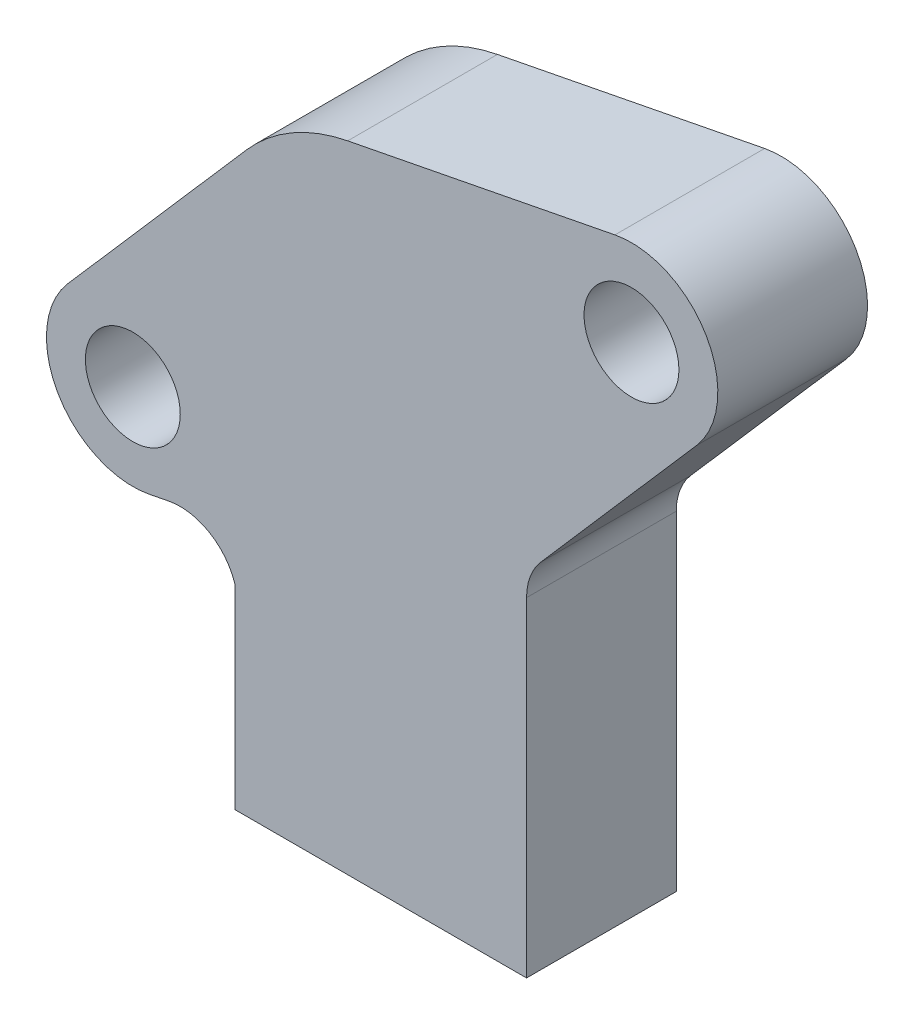
ISO-10303-21;
HEADER;
FILE_DESCRIPTION(('STEP AP214'),'2;1');
FILE_NAME('part.step','',(''),(''),'','','');
FILE_SCHEMA(('AUTOMOTIVE_DESIGN { 1 0 10303 214 1 1 1 1 }'));
ENDSEC;
DATA;
#1=APPLICATION_CONTEXT('core data for automotive mechanical design processes');
#2=APPLICATION_PROTOCOL_DEFINITION('international standard','automotive_design',2000,#1);
#3=PRODUCT_CONTEXT('',#1,'mechanical');
#4=PRODUCT('Part','Part','',(#3));
#5=PRODUCT_RELATED_PRODUCT_CATEGORY('part','',(#4));
#6=PRODUCT_DEFINITION_FORMATION('','',#4);
#7=PRODUCT_DEFINITION_CONTEXT('part definition',#1,'design');
#8=PRODUCT_DEFINITION('design','',#6,#7);
#9=PRODUCT_DEFINITION_SHAPE('','',#8);
#10=(LENGTH_UNIT() NAMED_UNIT(*) SI_UNIT(.MILLI.,.METRE.));
#11=(NAMED_UNIT(*) PLANE_ANGLE_UNIT() SI_UNIT($,.RADIAN.));
#12=(NAMED_UNIT(*) SI_UNIT($,.STERADIAN.) SOLID_ANGLE_UNIT());
#13=UNCERTAINTY_MEASURE_WITH_UNIT(LENGTH_MEASURE(1.E-05),#10,'distance_accuracy_value','');
#14=(GEOMETRIC_REPRESENTATION_CONTEXT(3) GLOBAL_UNCERTAINTY_ASSIGNED_CONTEXT((#13)) GLOBAL_UNIT_ASSIGNED_CONTEXT((#10,
#11,#12)) REPRESENTATION_CONTEXT('',''));
#15=CARTESIAN_POINT('',(0.,0.,0.));
#16=DIRECTION('',(0.,0.,1.));
#17=DIRECTION('',(1.,0.,0.));
#18=AXIS2_PLACEMENT_3D('',#15,#16,#17);
#19=CARTESIAN_POINT('',(8.9745656774153E-07,-3.76355821948626,-50.9532185088814));
#20=DIRECTION('',(-2.384595947247E-07,0.999999999999972,0.));
#21=DIRECTION('',(-0.999999999999972,-2.384595947247E-07,0.));
#22=AXIS2_PLACEMENT_3D('',#19,#20,#21);
#23=PLANE('',#22);
#24=DIRECTION('',(0.999999999999972,2.384595947247E-07,0.));
#25=VECTOR('',#24,1.);
#26=CARTESIAN_POINT('',(0.293919494826474,-3.76355814939855,9.09232219310188));
#27=LINE('',#26,#25);
#28=CARTESIAN_POINT('',(11.194976877036,-3.76355554993682,9.09232219310188));
#29=VERTEX_POINT('',#28);
#30=CARTESIAN_POINT('',(13.8410319973325,-3.76355491895921,9.09232219310188));
#31=VERTEX_POINT('',#30);
#32=EDGE_CURVE('E464',#29,#31,#27,.T.);
#33=ORIENTED_EDGE('',*,*,#32,.T.);
#34=DIRECTION('',(0.,0.,1.));
#35=VECTOR('',#34,1.);
#36=CARTESIAN_POINT('',(13.8410335872619,-3.76355491895921,-50.9532185088814));
#37=LINE('',#36,#35);
#38=CARTESIAN_POINT('',(13.8410335872619,-3.76355491895921,2.10732219310188));
#39=VERTEX_POINT('',#38);
#40=EDGE_CURVE('E355',#39,#31,#37,.T.);
#41=ORIENTED_EDGE('',*,*,#40,.F.);
#42=DIRECTION('',(0.999999999999972,2.384595947247E-07,0.));
#43=VECTOR('',#42,1.);
#44=CARTESIAN_POINT('',(8.9745656774153E-07,-3.76355821948626,2.10732219310188));
#45=LINE('',#44,#43);
#46=CARTESIAN_POINT('',(11.1949765410443,-3.76355653417888,2.10732219310188));
#47=VERTEX_POINT('',#46);
#48=EDGE_CURVE('E372',#47,#39,#45,.T.);
#49=ORIENTED_EDGE('',*,*,#48,.F.);
#50=DIRECTION('',(0.,0.,-1.));
#51=VECTOR('',#50,1.);
#52=CARTESIAN_POINT('',(11.1949765410441,-3.7635555499369,0.));
#53=LINE('',#52,#51);
#54=EDGE_CURVE('E363',#29,#47,#53,.T.);
#55=ORIENTED_EDGE('',*,*,#54,.F.);
#56=EDGE_LOOP('',(#33,#41,#49,#55));
#57=FACE_BOUND('',#56,.T.);
#58=ADVANCED_FACE('F41',(#57),#23,.T.);
#59=CARTESIAN_POINT('',(0.,0.,2.10732219310188));
#60=DIRECTION('',(0.,0.,1.));
#61=DIRECTION('',(1.,0.,0.));
#62=AXIS2_PLACEMENT_3D('',#59,#60,#61);
#63=PLANE('',#62);
#64=CARTESIAN_POINT('',(-6.60002350758909,12.2130402066751,2.10732219310188));
#65=DIRECTION('',(0.,0.,1.));
#66=DIRECTION('',(1.,0.,0.));
#67=AXIS2_PLACEMENT_3D('',#64,#65,#66);
#68=CIRCLE('',#67,2.6162);
#69=CARTESIAN_POINT('',(-3.98382350758909,12.2130402066751,2.10732219310188));
#70=VERTEX_POINT('',#69);
#71=EDGE_CURVE('E167',#70,#70,#68,.F.);
#72=ORIENTED_EDGE('',*,*,#71,.F.);
#73=EDGE_LOOP('',(#72));
#74=FACE_BOUND('',#73,.T.);
#75=CARTESIAN_POINT('',(20.8962792770201,28.0880467634327,2.10732219310188));
#76=DIRECTION('',(0.,0.,1.));
#77=DIRECTION('',(1.,0.,0.));
#78=AXIS2_PLACEMENT_3D('',#75,#76,#77);
#79=CIRCLE('',#78,2.6162);
#80=CARTESIAN_POINT('',(23.5124792770201,28.0880467634327,2.10732219310188));
#81=VERTEX_POINT('',#80);
#82=EDGE_CURVE('E163',#81,#81,#79,.F.);
#83=ORIENTED_EDGE('',*,*,#82,.F.);
#84=EDGE_LOOP('',(#83));
#85=FACE_BOUND('',#84,.T.);
#86=DIRECTION('',(2.38459594582664E-07,-0.999999999999971,0.));
#87=VECTOR('',#86,1.);
#88=CARTESIAN_POINT('',(11.194973962423,7.05010479643418,2.10732219310188));
#89=LINE('',#88,#87);
#90=CARTESIAN_POINT('',(11.1949768741737,-5.16056204205785,2.10732219310188));
#91=VERTEX_POINT('',#90);
#92=EDGE_CURVE('E340',#47,#91,#89,.T.);
#93=ORIENTED_EDGE('',*,*,#92,.F.);
#94=ORIENTED_EDGE('',*,*,#48,.T.);
#95=DIRECTION('',(-2.38459594475553E-07,0.999999999999972,0.));
#96=VECTOR('',#95,1.);
#97=CARTESIAN_POINT('',(13.8410326898053,3.30052704233395E-06,2.10732219310188));
#98=LINE('',#97,#96);
#99=CARTESIAN_POINT('',(13.8410319973325,2.97940231943418,2.10732219310188));
#100=VERTEX_POINT('',#99);
#101=EDGE_CURVE('E275',#39,#100,#98,.T.);
#102=ORIENTED_EDGE('',*,*,#101,.T.);
#103=DIRECTION('',(-1.,0.,0.));
#104=VECTOR('',#103,1.);
#105=CARTESIAN_POINT('',(0.,2.97940231943418,2.10732219310188));
#106=LINE('',#105,#104);
#107=CARTESIAN_POINT('',(0.293916587527097,2.97940231943418,2.10732219310188));
#108=VERTEX_POINT('',#107);
#109=EDGE_CURVE('E270',#100,#108,#106,.T.);
#110=ORIENTED_EDGE('',*,*,#109,.T.);
#111=DIRECTION('',(2.38459594605641E-07,-0.999999999999972,0.));
#112=VECTOR('',#111,1.);
#113=CARTESIAN_POINT('',(0.293918597369907,7.00877095758887E-08,2.10732219310188));
#114=LINE('',#113,#112);
#115=CARTESIAN_POINT('',(0.293919494826474,-3.76355814939855,2.10732219310188));
#116=VERTEX_POINT('',#115);
#117=EDGE_CURVE('E347',#108,#116,#114,.T.);
#118=ORIENTED_EDGE('',*,*,#117,.T.);
#119=CARTESIAN_POINT('',(2.9399765410443,-3.76355751842085,2.10732219310188));
#120=VERTEX_POINT('',#119);
#121=EDGE_CURVE('E260',#116,#120,#45,.T.);
#122=ORIENTED_EDGE('',*,*,#121,.T.);
#123=DIRECTION('',(2.38459594582664E-07,-0.999999999999971,0.));
#124=VECTOR('',#123,1.);
#125=CARTESIAN_POINT('',(2.93997396242324,7.05010282795023,2.10732219310188));
#126=LINE('',#125,#124);
#127=CARTESIAN_POINT('',(2.93997687417236,-5.16055751842081,2.10732219310188));
#128=VERTEX_POINT('',#127);
#129=EDGE_CURVE('E240',#120,#128,#126,.T.);
#130=ORIENTED_EDGE('',*,*,#129,.T.);
#131=DIRECTION('',(-0.999999999999972,-2.38459594582664E-07,0.));
#132=VECTOR('',#131,1.);
#133=CARTESIAN_POINT('',(1.23058462083895E-06,-5.16055821948621,2.10732219310188));
#134=LINE('',#133,#132);
#135=CARTESIAN_POINT('',(-0.976080172045436,-5.16055845224219,2.10732219310188));
#136=VERTEX_POINT('',#135);
#137=EDGE_CURVE('E256',#128,#136,#134,.T.);
#138=ORIENTED_EDGE('',*,*,#137,.T.);
#139=DIRECTION('',(2.38459593380394E-07,-0.999999999999972,0.));
#140=VECTOR('',#139,1.);
#141=CARTESIAN_POINT('',(-0.976081402630059,-2.32755974377335E-07,2.10732219310188));
#142=LINE('',#141,#140);
#143=CARTESIAN_POINT('',(-0.976082746216754,5.63444154775751,2.10732219310188));
#144=VERTEX_POINT('',#143);
#145=EDGE_CURVE('E359',#144,#136,#142,.T.);
#146=ORIENTED_EDGE('',*,*,#145,.F.);
#147=CARTESIAN_POINT('',(-3.9897684155214,4.63528005599162,2.10732219310188));
#148=DIRECTION('',(0.,0.,1.));
#149=DIRECTION('',(1.,0.,0.));
#150=AXIS2_PLACEMENT_3D('',#147,#148,#149);
#151=CIRCLE('',#150,3.175);
#152=CARTESIAN_POINT('',(-4.5981191947007,7.7514530822326,2.10732219310188));
#153=VERTEX_POINT('',#152);
#154=EDGE_CURVE('E280',#153,#144,#151,.F.);
#155=ORIENTED_EDGE('',*,*,#154,.F.);
#156=DIRECTION('',(0.981471819288502,0.191606544623399,0.));
#157=VECTOR('',#156,1.);
#158=CARTESIAN_POINT('',(-1.62652160937931,8.33157931117255,2.10732219310188));
#159=LINE('',#158,#157);
#160=CARTESIAN_POINT('',(-5.68749733882018,7.53878066731364,2.10732219310188));
#161=VERTEX_POINT('',#160);
#162=EDGE_CURVE('E171',#161,#153,#159,.T.);
#163=ORIENTED_EDGE('',*,*,#162,.F.);
#164=CARTESIAN_POINT('',(-6.60002350758909,12.2130402066751,2.10732219310188));
#165=DIRECTION('',(0.,0.,1.));
#166=DIRECTION('',(1.,0.,0.));
#167=AXIS2_PLACEMENT_3D('',#164,#165,#166);
#168=CIRCLE('',#167,4.7625);
#169=CARTESIAN_POINT('',(-10.1917894196903,15.3404391071461,2.10732219310188));
#170=VERTEX_POINT('',#169);
#171=EDGE_CURVE('E104',#170,#161,#168,.T.);
#172=ORIENTED_EDGE('',*,*,#171,.F.);
#173=DIRECTION('',(-0.656671685138276,-0.754176569470079,0.));
#174=VECTOR('',#173,1.);
#175=CARTESIAN_POINT('',(-13.3942066295272,11.6625159074911,2.10732219310188));
#176=LINE('',#175,#174);
#177=CARTESIAN_POINT('',(-0.332323254887378,26.6638729284349,2.10732219310188));
#178=VERTEX_POINT('',#177);
#179=EDGE_CURVE('E191',#178,#170,#176,.T.);
#180=ORIENTED_EDGE('',*,*,#179,.F.);
#181=CARTESIAN_POINT('',(7.1481278847155,20.1505434850539,2.10732219310188));
#182=DIRECTION('',(0.,0.,1.));
#183=DIRECTION('',(1.,0.,0.));
#184=AXIS2_PLACEMENT_3D('',#181,#182,#183);
#185=CIRCLE('',#184,9.9187);
#186=CARTESIAN_POINT('',(5.2476400505594,29.8854680190308,2.10732219310188));
#187=VERTEX_POINT('',#186);
#188=EDGE_CURVE('E148',#187,#178,#185,.T.);
#189=ORIENTED_EDGE('',*,*,#188,.F.);
#190=DIRECTION('',(-0.981471819288502,-0.191606544623398,0.));
#191=VECTOR('',#190,1.);
#192=CARTESIAN_POINT('',(-5.4274972776915,27.8014283791263,2.10732219310188));
#193=LINE('',#192,#191);
#194=CARTESIAN_POINT('',(19.9837531082512,32.7623063027941,2.10732219310188));
#195=VERTEX_POINT('',#194);
#196=EDGE_CURVE('E186',#195,#187,#193,.T.);
#197=ORIENTED_EDGE('',*,*,#196,.F.);
#198=CARTESIAN_POINT('',(20.8962792770201,28.0880467634327,2.10732219310188));
#199=DIRECTION('',(0.,0.,1.));
#200=DIRECTION('',(1.,0.,0.));
#201=AXIS2_PLACEMENT_3D('',#198,#199,#200);
#202=CIRCLE('',#201,4.7625);
#203=CARTESIAN_POINT('',(24.4880451891213,24.9606478629617,2.10732219310188));
#204=VERTEX_POINT('',#203);
#205=EDGE_CURVE('E183',#204,#195,#202,.T.);
#206=ORIENTED_EDGE('',*,*,#205,.F.);
#207=DIRECTION('',(0.656671685138276,0.754176569470079,0.));
#208=VECTOR('',#207,1.);
#209=CARTESIAN_POINT('',(1.56669564967859,-1.36414297927093,2.10732219310188));
#210=LINE('',#209,#208);
#211=CARTESIAN_POINT('',(15.8915189811089,15.0876796938632,2.10732219310188));
#212=VERTEX_POINT('',#211);
#213=EDGE_CURVE('E180',#212,#204,#210,.T.);
#214=ORIENTED_EDGE('',*,*,#213,.F.);
#215=CARTESIAN_POINT('',(18.2860295891764,13.0027470935492,2.10732219310188));
#216=DIRECTION('',(0.,0.,1.));
#217=DIRECTION('',(1.,0.,0.));
#218=AXIS2_PLACEMENT_3D('',#215,#216,#217);
#219=CIRCLE('',#218,3.175);
#220=CARTESIAN_POINT('',(15.1110295891765,13.00274633644,2.10732219310188));
#221=VERTEX_POINT('',#220);
#222=EDGE_CURVE('E177',#221,#212,#219,.F.);
#223=ORIENTED_EDGE('',*,*,#222,.F.);
#224=DIRECTION('',(-2.3845959454018E-07,0.999999999999972,0.));
#225=VECTOR('',#224,1.);
#226=CARTESIAN_POINT('',(15.1110326898053,3.60337072829448E-06,2.10732219310188));
#227=LINE('',#226,#225);
#228=CARTESIAN_POINT('',(15.1110339203899,-5.16055461611548,2.10732219310188));
#229=VERTEX_POINT('',#228);
#230=EDGE_CURVE('E174',#229,#221,#227,.T.);
#231=ORIENTED_EDGE('',*,*,#230,.F.);
#232=EDGE_CURVE('E45',#229,#91,#134,.T.);
#233=ORIENTED_EDGE('',*,*,#232,.T.);
#234=EDGE_LOOP('',(#93,#94,#102,#110,#118,#122,#130,#138,#146,#155,#163,#172,#180,#189,#197,
#206,#214,#223,#231,#233));
#235=FACE_BOUND('',#234,.T.);
#236=ADVANCED_FACE('F253',(#74,#85,#235),#63,.F.);
#237=CARTESIAN_POINT('',(0.293919494826474,-3.76355814939855,9.09232219310188));
#238=VERTEX_POINT('',#237);
#239=CARTESIAN_POINT('',(2.93997396003667,-3.76355751842147,9.09232219310188));
#240=VERTEX_POINT('',#239);
#241=EDGE_CURVE('E452',#238,#240,#27,.T.);
#242=ORIENTED_EDGE('',*,*,#241,.T.);
#243=DIRECTION('',(0.,0.,-1.));
#244=VECTOR('',#243,1.);
#245=CARTESIAN_POINT('',(2.9399765410443,-3.76355751842086,0.));
#246=LINE('',#245,#244);
#247=EDGE_CURVE('E262',#240,#120,#246,.T.);
#248=ORIENTED_EDGE('',*,*,#247,.T.);
#249=ORIENTED_EDGE('',*,*,#121,.F.);
#250=DIRECTION('',(0.,0.,1.));
#251=VECTOR('',#250,1.);
#252=CARTESIAN_POINT('',(0.293919494826474,-3.76355814939855,-50.9532185088814));
#253=LINE('',#252,#251);
#254=EDGE_CURVE('E351',#116,#238,#253,.T.);
#255=ORIENTED_EDGE('',*,*,#254,.T.);
#256=EDGE_LOOP('',(#242,#248,#249,#255));
#257=FACE_BOUND('',#256,.T.);
#258=ADVANCED_FACE('F451',(#257),#23,.T.);
#259=CARTESIAN_POINT('',(1.23058462083895E-06,-5.16055821948621,-50.9532185088814));
#260=DIRECTION('',(2.38459594582664E-07,-0.999999999999972,0.));
#261=DIRECTION('',(0.999999999999972,2.38459594582664E-07,0.));
#262=AXIS2_PLACEMENT_3D('',#259,#260,#261);
#263=PLANE('',#262);
#264=DIRECTION('',(0.999999999999972,2.38459594582664E-07,0.));
#265=VECTOR('',#264,1.);
#266=CARTESIAN_POINT('',(1.23058462083895E-06,-5.16055821948621,9.09232219310189));
#267=LINE('',#266,#265);
#268=CARTESIAN_POINT('',(2.93997687178555,-5.16055653417914,9.09232219310188));
#269=VERTEX_POINT('',#268);
#270=CARTESIAN_POINT('',(11.1949768770389,-5.16055554993686,9.09232219310189));
#271=VERTEX_POINT('',#270);
#272=EDGE_CURVE('E223',#269,#271,#267,.T.);
#273=ORIENTED_EDGE('',*,*,#272,.T.);
#274=DIRECTION('',(0.,0.,-1.));
#275=VECTOR('',#274,1.);
#276=CARTESIAN_POINT('',(11.1949768741721,-5.16055554993686,-50.9532185088814));
#277=LINE('',#276,#275);
#278=EDGE_CURVE('E11',#271,#91,#277,.T.);
#279=ORIENTED_EDGE('',*,*,#278,.T.);
#280=ORIENTED_EDGE('',*,*,#232,.F.);
#281=DIRECTION('',(0.,0.,1.));
#282=VECTOR('',#281,1.);
#283=CARTESIAN_POINT('',(15.1110339203899,-5.16055461611548,-50.9532185088814));
#284=LINE('',#283,#282);
#285=CARTESIAN_POINT('',(15.1110339203899,-5.16055461611548,10.3623221931019));
#286=VERTEX_POINT('',#285);
#287=EDGE_CURVE('E335',#229,#286,#284,.T.);
#288=ORIENTED_EDGE('',*,*,#287,.T.);
#289=DIRECTION('',(0.999999999999972,2.38459594582664E-07,0.));
#290=VECTOR('',#289,1.);
#291=CARTESIAN_POINT('',(1.23058462083895E-06,-5.16055821948621,10.3623221931019));
#292=LINE('',#291,#290);
#293=CARTESIAN_POINT('',(-0.976080172045436,-5.16055845224219,10.3623221931019));
#294=VERTEX_POINT('',#293);
#295=EDGE_CURVE('E343',#294,#286,#292,.T.);
#296=ORIENTED_EDGE('',*,*,#295,.F.);
#297=DIRECTION('',(0.,0.,1.));
#298=VECTOR('',#297,1.);
#299=CARTESIAN_POINT('',(-0.976080172045436,-5.16055845224219,-50.9532185088814));
#300=LINE('',#299,#298);
#301=EDGE_CURVE('E268',#136,#294,#300,.T.);
#302=ORIENTED_EDGE('',*,*,#301,.F.);
#303=ORIENTED_EDGE('',*,*,#137,.F.);
#304=DIRECTION('',(0.,0.,-1.));
#305=VECTOR('',#304,1.);
#306=CARTESIAN_POINT('',(2.93997687417236,-5.16055751842081,-50.9532185088814));
#307=LINE('',#306,#305);
#308=EDGE_CURVE('E52',#269,#128,#307,.T.);
#309=ORIENTED_EDGE('',*,*,#308,.F.);
#310=EDGE_LOOP('',(#273,#279,#280,#288,#296,#302,#303,#309));
#311=FACE_BOUND('',#310,.T.);
#312=ADVANCED_FACE('F265',(#311),#263,.T.);
#313=CARTESIAN_POINT('',(-1.62652160937931,8.33157931117255,10.3623221931019));
#314=DIRECTION('',(-0.191606544623399,0.981471819288502,0.));
#315=DIRECTION('',(-0.981471819288502,-0.191606544623399,0.));
#316=AXIS2_PLACEMENT_3D('',#313,#314,#315);
#317=PLANE('',#316);
#318=ORIENTED_EDGE('',*,*,#162,.T.);
#319=DIRECTION('',(0.,0.,-1.));
#320=VECTOR('',#319,1.);
#321=CARTESIAN_POINT('',(-4.5981191947007,7.7514530822326,10.3623221931019));
#322=LINE('',#321,#320);
#323=CARTESIAN_POINT('',(-4.5981191947007,7.7514530822326,10.3623221931019));
#324=VERTEX_POINT('',#323);
#325=EDGE_CURVE('E219',#324,#153,#322,.T.);
#326=ORIENTED_EDGE('',*,*,#325,.F.);
#327=DIRECTION('',(0.981471819288502,0.191606544623399,0.));
#328=VECTOR('',#327,1.);
#329=CARTESIAN_POINT('',(-1.62652160937931,8.33157931117255,10.3623221931019));
#330=LINE('',#329,#328);
#331=CARTESIAN_POINT('',(-5.68749733882018,7.53878066731364,10.3623221931019));
#332=VERTEX_POINT('',#331);
#333=EDGE_CURVE('E110',#332,#324,#330,.T.);
#334=ORIENTED_EDGE('',*,*,#333,.F.);
#335=DIRECTION('',(0.,0.,-1.));
#336=VECTOR('',#335,1.);
#337=CARTESIAN_POINT('',(-5.68749733882018,7.53878066731364,10.3623221931019));
#338=LINE('',#337,#336);
#339=EDGE_CURVE('E159',#332,#161,#338,.T.);
#340=ORIENTED_EDGE('',*,*,#339,.T.);
#341=EDGE_LOOP('',(#318,#326,#334,#340));
#342=FACE_BOUND('',#341,.T.);
#343=ADVANCED_FACE('F316',(#342),#317,.F.);
#344=CARTESIAN_POINT('',(15.1110326898053,3.60337072829448E-06,10.3623221931019));
#345=DIRECTION('',(-0.999999999999972,-2.3845959454018E-07,0.));
#346=DIRECTION('',(2.3845959454018E-07,-0.999999999999972,0.));
#347=AXIS2_PLACEMENT_3D('',#344,#345,#346);
#348=PLANE('',#347);
#349=ORIENTED_EDGE('',*,*,#230,.T.);
#350=DIRECTION('',(0.,0.,-1.));
#351=VECTOR('',#350,1.);
#352=CARTESIAN_POINT('',(15.1110295891765,13.00274633644,10.3623221931019));
#353=LINE('',#352,#351);
#354=CARTESIAN_POINT('',(15.1110295891765,13.00274633644,10.3623221931019));
#355=VERTEX_POINT('',#354);
#356=EDGE_CURVE('E215',#355,#221,#353,.T.);
#357=ORIENTED_EDGE('',*,*,#356,.F.);
#358=DIRECTION('',(-2.3845959454018E-07,0.999999999999972,0.));
#359=VECTOR('',#358,1.);
#360=CARTESIAN_POINT('',(15.1110326898053,3.60337072829448E-06,10.3623221931019));
#361=LINE('',#360,#359);
#362=EDGE_CURVE('E291',#286,#355,#361,.T.);
#363=ORIENTED_EDGE('',*,*,#362,.F.);
#364=ORIENTED_EDGE('',*,*,#287,.F.);
#365=EDGE_LOOP('',(#349,#357,#363,#364));
#366=FACE_BOUND('',#365,.T.);
#367=ADVANCED_FACE('F476',(#366),#348,.F.);
#368=CARTESIAN_POINT('',(18.2860295891764,13.0027470935492,10.3623221931019));
#369=DIRECTION('',(0.,0.,-1.));
#370=DIRECTION('',(-1.,0.,0.));
#371=AXIS2_PLACEMENT_3D('',#368,#369,#370);
#372=CYLINDRICAL_SURFACE('',#371,3.175);
#373=ORIENTED_EDGE('',*,*,#222,.T.);
#374=DIRECTION('',(0.,0.,-1.));
#375=VECTOR('',#374,1.);
#376=CARTESIAN_POINT('',(15.8915189811089,15.0876796938632,10.3623221931019));
#377=LINE('',#376,#375);
#378=CARTESIAN_POINT('',(15.8915189811089,15.0876796938632,10.3623221931019));
#379=VERTEX_POINT('',#378);
#380=EDGE_CURVE('E211',#379,#212,#377,.T.);
#381=ORIENTED_EDGE('',*,*,#380,.F.);
#382=CARTESIAN_POINT('',(18.2860295891764,13.0027470935492,10.3623221931019));
#383=DIRECTION('',(0.,0.,1.));
#384=DIRECTION('',(1.,0.,0.));
#385=AXIS2_PLACEMENT_3D('',#382,#383,#384);
#386=CIRCLE('',#385,3.175);
#387=EDGE_CURVE('E294',#355,#379,#386,.F.);
#388=ORIENTED_EDGE('',*,*,#387,.F.);
#389=ORIENTED_EDGE('',*,*,#356,.T.);
#390=EDGE_LOOP('',(#373,#381,#388,#389));
#391=FACE_BOUND('',#390,.T.);
#392=ADVANCED_FACE('F480',(#391),#372,.F.);
#393=CARTESIAN_POINT('',(1.56669564967859,-1.36414297927093,10.3623221931019));
#394=DIRECTION('',(-0.754176569470079,0.656671685138276,0.));
#395=DIRECTION('',(-0.656671685138276,-0.754176569470079,0.));
#396=AXIS2_PLACEMENT_3D('',#393,#394,#395);
#397=PLANE('',#396);
#398=ORIENTED_EDGE('',*,*,#213,.T.);
#399=DIRECTION('',(0.,0.,-1.));
#400=VECTOR('',#399,1.);
#401=CARTESIAN_POINT('',(24.4880451891213,24.9606478629617,10.3623221931019));
#402=LINE('',#401,#400);
#403=CARTESIAN_POINT('',(24.4880451891213,24.9606478629617,10.3623221931019));
#404=VERTEX_POINT('',#403);
#405=EDGE_CURVE('E207',#404,#204,#402,.T.);
#406=ORIENTED_EDGE('',*,*,#405,.F.);
#407=DIRECTION('',(0.656671685138276,0.754176569470079,0.));
#408=VECTOR('',#407,1.);
#409=CARTESIAN_POINT('',(1.56669564967859,-1.36414297927093,10.3623221931019));
#410=LINE('',#409,#408);
#411=EDGE_CURVE('E297',#379,#404,#410,.T.);
#412=ORIENTED_EDGE('',*,*,#411,.F.);
#413=ORIENTED_EDGE('',*,*,#380,.T.);
#414=EDGE_LOOP('',(#398,#406,#412,#413));
#415=FACE_BOUND('',#414,.T.);
#416=ADVANCED_FACE('F482',(#415),#397,.F.);
#417=CARTESIAN_POINT('',(20.8962792770201,28.0880467634327,10.3623221931019));
#418=DIRECTION('',(0.,0.,-1.));
#419=DIRECTION('',(-1.,0.,0.));
#420=AXIS2_PLACEMENT_3D('',#417,#418,#419);
#421=CYLINDRICAL_SURFACE('',#420,4.7625);
#422=ORIENTED_EDGE('',*,*,#205,.T.);
#423=DIRECTION('',(0.,0.,-1.));
#424=VECTOR('',#423,1.);
#425=CARTESIAN_POINT('',(19.9837531082512,32.7623063027941,10.3623221931019));
#426=LINE('',#425,#424);
#427=CARTESIAN_POINT('',(19.9837531082512,32.7623063027941,10.3623221931019));
#428=VERTEX_POINT('',#427);
#429=EDGE_CURVE('E203',#428,#195,#426,.T.);
#430=ORIENTED_EDGE('',*,*,#429,.F.);
#431=CARTESIAN_POINT('',(20.8962792770201,28.0880467634327,10.3623221931019));
#432=DIRECTION('',(0.,0.,1.));
#433=DIRECTION('',(1.,0.,0.));
#434=AXIS2_PLACEMENT_3D('',#431,#432,#433);
#435=CIRCLE('',#434,4.7625);
#436=EDGE_CURVE('E300',#404,#428,#435,.T.);
#437=ORIENTED_EDGE('',*,*,#436,.F.);
#438=ORIENTED_EDGE('',*,*,#405,.T.);
#439=EDGE_LOOP('',(#422,#430,#437,#438));
#440=FACE_BOUND('',#439,.T.);
#441=ADVANCED_FACE('F308',(#440),#421,.T.);
#442=CARTESIAN_POINT('',(-5.4274972776915,27.8014283791263,10.3623221931019));
#443=DIRECTION('',(0.191606544623398,-0.981471819288502,0.));
#444=DIRECTION('',(0.981471819288502,0.191606544623398,0.));
#445=AXIS2_PLACEMENT_3D('',#442,#443,#444);
#446=PLANE('',#445);
#447=ORIENTED_EDGE('',*,*,#196,.T.);
#448=DIRECTION('',(0.,0.,-1.));
#449=VECTOR('',#448,1.);
#450=CARTESIAN_POINT('',(5.2476400505594,29.8854680190308,10.3623221931019));
#451=LINE('',#450,#449);
#452=CARTESIAN_POINT('',(5.2476400505594,29.8854680190308,10.3623221931019));
#453=VERTEX_POINT('',#452);
#454=EDGE_CURVE('E152',#453,#187,#451,.T.);
#455=ORIENTED_EDGE('',*,*,#454,.F.);
#456=DIRECTION('',(-0.981471819288502,-0.191606544623398,0.));
#457=VECTOR('',#456,1.);
#458=CARTESIAN_POINT('',(-5.4274972776915,27.8014283791263,10.3623221931019));
#459=LINE('',#458,#457);
#460=EDGE_CURVE('E138',#428,#453,#459,.T.);
#461=ORIENTED_EDGE('',*,*,#460,.F.);
#462=ORIENTED_EDGE('',*,*,#429,.T.);
#463=EDGE_LOOP('',(#447,#455,#461,#462));
#464=FACE_BOUND('',#463,.T.);
#465=ADVANCED_FACE('F312',(#464),#446,.F.);
#466=CARTESIAN_POINT('',(7.1481278847155,20.1505434850539,10.3623221931019));
#467=DIRECTION('',(0.,0.,-1.));
#468=DIRECTION('',(-1.,0.,0.));
#469=AXIS2_PLACEMENT_3D('',#466,#467,#468);
#470=CYLINDRICAL_SURFACE('',#469,9.9187);
#471=ORIENTED_EDGE('',*,*,#188,.T.);
#472=DIRECTION('',(0.,0.,-1.));
#473=VECTOR('',#472,1.);
#474=CARTESIAN_POINT('',(-0.332323254887378,26.6638729284349,10.3623221931019));
#475=LINE('',#474,#473);
#476=CARTESIAN_POINT('',(-0.332323254887378,26.6638729284349,10.3623221931019));
#477=VERTEX_POINT('',#476);
#478=EDGE_CURVE('E145',#477,#178,#475,.T.);
#479=ORIENTED_EDGE('',*,*,#478,.F.);
#480=CARTESIAN_POINT('',(7.1481278847155,20.1505434850539,10.3623221931019));
#481=DIRECTION('',(0.,0.,1.));
#482=DIRECTION('',(1.,0.,0.));
#483=AXIS2_PLACEMENT_3D('',#480,#481,#482);
#484=CIRCLE('',#483,9.9187);
#485=EDGE_CURVE('E131',#453,#477,#484,.T.);
#486=ORIENTED_EDGE('',*,*,#485,.F.);
#487=ORIENTED_EDGE('',*,*,#454,.T.);
#488=EDGE_LOOP('',(#471,#479,#486,#487));
#489=FACE_BOUND('',#488,.T.);
#490=ADVANCED_FACE('F146',(#489),#470,.T.);
#491=CARTESIAN_POINT('',(-13.3942066295272,11.6625159074911,10.3623221931019));
#492=DIRECTION('',(0.754176569470079,-0.656671685138276,0.));
#493=DIRECTION('',(0.656671685138276,0.754176569470079,0.));
#494=AXIS2_PLACEMENT_3D('',#491,#492,#493);
#495=PLANE('',#494);
#496=ORIENTED_EDGE('',*,*,#179,.T.);
#497=DIRECTION('',(0.,0.,-1.));
#498=VECTOR('',#497,1.);
#499=CARTESIAN_POINT('',(-10.1917894196903,15.3404391071461,10.3623221931019));
#500=LINE('',#499,#498);
#501=CARTESIAN_POINT('',(-10.1917894196903,15.3404391071461,10.3623221931019));
#502=VERTEX_POINT('',#501);
#503=EDGE_CURVE('E153',#502,#170,#500,.T.);
#504=ORIENTED_EDGE('',*,*,#503,.F.);
#505=DIRECTION('',(-0.656671685138276,-0.754176569470079,0.));
#506=VECTOR('',#505,1.);
#507=CARTESIAN_POINT('',(-13.3942066295272,11.6625159074911,10.3623221931019));
#508=LINE('',#507,#506);
#509=EDGE_CURVE('E135',#477,#502,#508,.T.);
#510=ORIENTED_EDGE('',*,*,#509,.F.);
#511=ORIENTED_EDGE('',*,*,#478,.T.);
#512=EDGE_LOOP('',(#496,#504,#510,#511));
#513=FACE_BOUND('',#512,.T.);
#514=ADVANCED_FACE('F155',(#513),#495,.F.);
#515=CARTESIAN_POINT('',(-6.60002350758909,12.2130402066751,10.3623221931019));
#516=DIRECTION('',(0.,0.,-1.));
#517=DIRECTION('',(-1.,0.,0.));
#518=AXIS2_PLACEMENT_3D('',#515,#516,#517);
#519=CYLINDRICAL_SURFACE('',#518,2.6162);
#520=CARTESIAN_POINT('',(-6.60002350758909,12.2130402066751,10.3623221931019));
#521=DIRECTION('',(0.,0.,1.));
#522=DIRECTION('',(1.,0.,0.));
#523=AXIS2_PLACEMENT_3D('',#520,#521,#522);
#524=CIRCLE('',#523,2.6162);
#525=CARTESIAN_POINT('',(-3.98382350758909,12.2130402066751,10.3623221931019));
#526=VERTEX_POINT('',#525);
#527=EDGE_CURVE('E285',#526,#526,#524,.F.);
#528=ORIENTED_EDGE('',*,*,#527,.F.);
#529=EDGE_LOOP('',(#528));
#530=FACE_BOUND('',#529,.T.);
#531=ORIENTED_EDGE('',*,*,#71,.T.);
#532=EDGE_LOOP('',(#531));
#533=FACE_BOUND('',#532,.T.);
#534=ADVANCED_FACE('F521',(#530,#533),#519,.F.);
#535=CARTESIAN_POINT('',(20.8962792770201,28.0880467634327,10.3623221931019));
#536=DIRECTION('',(0.,0.,-1.));
#537=DIRECTION('',(-1.,0.,0.));
#538=AXIS2_PLACEMENT_3D('',#535,#536,#537);
#539=CYLINDRICAL_SURFACE('',#538,2.6162);
#540=CARTESIAN_POINT('',(20.8962792770201,28.0880467634327,10.3623221931019));
#541=DIRECTION('',(0.,0.,1.));
#542=DIRECTION('',(1.,0.,0.));
#543=AXIS2_PLACEMENT_3D('',#540,#541,#542);
#544=CIRCLE('',#543,2.6162);
#545=CARTESIAN_POINT('',(23.5124792770201,28.0880467634327,10.3623221931019));
#546=VERTEX_POINT('',#545);
#547=EDGE_CURVE('E196',#546,#546,#544,.F.);
#548=ORIENTED_EDGE('',*,*,#547,.F.);
#549=EDGE_LOOP('',(#548));
#550=FACE_BOUND('',#549,.T.);
#551=ORIENTED_EDGE('',*,*,#82,.T.);
#552=EDGE_LOOP('',(#551));
#553=FACE_BOUND('',#552,.T.);
#554=ADVANCED_FACE('F43',(#550,#553),#539,.F.);
#555=CARTESIAN_POINT('',(-6.60002350758909,12.2130402066751,10.3623221931019));
#556=DIRECTION('',(0.,0.,-1.));
#557=DIRECTION('',(-1.,0.,0.));
#558=AXIS2_PLACEMENT_3D('',#555,#556,#557);
#559=CYLINDRICAL_SURFACE('',#558,4.7625);
#560=ORIENTED_EDGE('',*,*,#171,.T.);
#561=ORIENTED_EDGE('',*,*,#339,.F.);
#562=CARTESIAN_POINT('',(-6.60002350758909,12.2130402066751,10.3623221931019));
#563=DIRECTION('',(0.,0.,1.));
#564=DIRECTION('',(1.,0.,0.));
#565=AXIS2_PLACEMENT_3D('',#562,#563,#564);
#566=CIRCLE('',#565,4.7625);
#567=EDGE_CURVE('E68',#502,#332,#566,.T.);
#568=ORIENTED_EDGE('',*,*,#567,.F.);
#569=ORIENTED_EDGE('',*,*,#503,.T.);
#570=EDGE_LOOP('',(#560,#561,#568,#569));
#571=FACE_BOUND('',#570,.T.);
#572=ADVANCED_FACE('F314',(#571),#559,.T.);
#573=CARTESIAN_POINT('',(0.,0.,10.3623221931019));
#574=DIRECTION('',(0.,0.,1.));
#575=DIRECTION('',(1.,0.,0.));
#576=AXIS2_PLACEMENT_3D('',#573,#574,#575);
#577=PLANE('',#576);
#578=ORIENTED_EDGE('',*,*,#547,.T.);
#579=EDGE_LOOP('',(#578));
#580=FACE_BOUND('',#579,.T.);
#581=ORIENTED_EDGE('',*,*,#527,.T.);
#582=EDGE_LOOP('',(#581));
#583=FACE_BOUND('',#582,.T.);
#584=ORIENTED_EDGE('',*,*,#333,.T.);
#585=CARTESIAN_POINT('',(-3.9897684155214,4.63528005599162,10.3623221931019));
#586=DIRECTION('',(0.,0.,1.));
#587=DIRECTION('',(1.,0.,0.));
#588=AXIS2_PLACEMENT_3D('',#585,#586,#587);
#589=CIRCLE('',#588,3.175);
#590=CARTESIAN_POINT('',(-0.976082746216755,5.63444154775751,10.3623221931019));
#591=VERTEX_POINT('',#590);
#592=EDGE_CURVE('E322',#591,#324,#589,.T.);
#593=ORIENTED_EDGE('',*,*,#592,.F.);
#594=DIRECTION('',(-2.38459593380394E-07,0.999999999999972,0.));
#595=VECTOR('',#594,1.);
#596=CARTESIAN_POINT('',(-0.976081402630059,-2.32755974377335E-07,10.3623221931019));
#597=LINE('',#596,#595);
#598=EDGE_CURVE('E348',#294,#591,#597,.T.);
#599=ORIENTED_EDGE('',*,*,#598,.F.);
#600=ORIENTED_EDGE('',*,*,#295,.T.);
#601=ORIENTED_EDGE('',*,*,#362,.T.);
#602=ORIENTED_EDGE('',*,*,#387,.T.);
#603=ORIENTED_EDGE('',*,*,#411,.T.);
#604=ORIENTED_EDGE('',*,*,#436,.T.);
#605=ORIENTED_EDGE('',*,*,#460,.T.);
#606=ORIENTED_EDGE('',*,*,#485,.T.);
#607=ORIENTED_EDGE('',*,*,#509,.T.);
#608=ORIENTED_EDGE('',*,*,#567,.T.);
#609=EDGE_LOOP('',(#584,#593,#599,#600,#601,#602,#603,#604,#605,#606,#607,#608));
#610=FACE_BOUND('',#609,.T.);
#611=ADVANCED_FACE('F133',(#580,#583,#610),#577,.T.);
#612=CARTESIAN_POINT('',(0.293918597369907,7.00877095758887E-08,-50.9532185088814));
#613=DIRECTION('',(0.999999999999972,2.38459594605641E-07,0.));
#614=DIRECTION('',(-2.38459594605641E-07,0.999999999999972,0.));
#615=AXIS2_PLACEMENT_3D('',#612,#613,#614);
#616=PLANE('',#615);
#617=DIRECTION('',(2.38459594613772E-07,-0.999999999999972,0.));
#618=VECTOR('',#617,1.);
#619=CARTESIAN_POINT('',(0.293917904897127,2.90394185060127,9.09232219310188));
#620=LINE('',#619,#618);
#621=CARTESIAN_POINT('',(0.293916587527096,2.97940231943418,9.09232219310188));
#622=VERTEX_POINT('',#621);
#623=EDGE_CURVE('E433',#622,#238,#620,.T.);
#624=ORIENTED_EDGE('',*,*,#623,.T.);
#625=ORIENTED_EDGE('',*,*,#254,.F.);
#626=ORIENTED_EDGE('',*,*,#117,.F.);
#627=DIRECTION('',(0.,0.,1.));
#628=VECTOR('',#627,1.);
#629=CARTESIAN_POINT('',(0.293916587527097,2.97940231943418,-50.9532185088814));
#630=LINE('',#629,#628);
#631=EDGE_CURVE('E356',#108,#622,#630,.T.);
#632=ORIENTED_EDGE('',*,*,#631,.T.);
#633=EDGE_LOOP('',(#624,#625,#626,#632));
#634=FACE_BOUND('',#633,.T.);
#635=ADVANCED_FACE('F449',(#634),#616,.T.);
#636=CARTESIAN_POINT('',(13.8410326898053,3.30052704233395E-06,-50.9532185088814));
#637=DIRECTION('',(-0.999999999999972,-2.38459594475553E-07,0.));
#638=DIRECTION('',(2.38459594475553E-07,-0.999999999999972,0.));
#639=AXIS2_PLACEMENT_3D('',#636,#637,#638);
#640=PLANE('',#639);
#641=DIRECTION('',(0.,1.,0.));
#642=VECTOR('',#641,1.);
#643=CARTESIAN_POINT('',(13.8410319973325,2.90394508104061,9.09232219310188));
#644=LINE('',#643,#642);
#645=CARTESIAN_POINT('',(13.8410319973325,2.97940231943418,9.09232219310188));
#646=VERTEX_POINT('',#645);
#647=EDGE_CURVE('E430',#31,#646,#644,.T.);
#648=ORIENTED_EDGE('',*,*,#647,.T.);
#649=DIRECTION('',(0.,0.,1.));
#650=VECTOR('',#649,1.);
#651=CARTESIAN_POINT('',(13.8410319973325,2.97940231943418,-50.9532185088814));
#652=LINE('',#651,#650);
#653=EDGE_CURVE('E330',#100,#646,#652,.T.);
#654=ORIENTED_EDGE('',*,*,#653,.F.);
#655=ORIENTED_EDGE('',*,*,#101,.F.);
#656=ORIENTED_EDGE('',*,*,#40,.T.);
#657=EDGE_LOOP('',(#648,#654,#655,#656));
#658=FACE_BOUND('',#657,.T.);
#659=ADVANCED_FACE('F440',(#658),#640,.T.);
#660=CARTESIAN_POINT('',(-0.976081402630059,-2.32755974377335E-07,-50.9532185088814));
#661=DIRECTION('',(0.999999999999972,2.38459593380394E-07,0.));
#662=DIRECTION('',(-2.38459593380394E-07,0.999999999999972,0.));
#663=AXIS2_PLACEMENT_3D('',#660,#661,#662);
#664=PLANE('',#663);
#665=DIRECTION('',(0.,0.,1.));
#666=VECTOR('',#665,1.);
#667=CARTESIAN_POINT('',(-0.976082746216755,5.63444154775751,-50.9532185088814));
#668=LINE('',#667,#666);
#669=EDGE_CURVE('E326',#144,#591,#668,.T.);
#670=ORIENTED_EDGE('',*,*,#669,.F.);
#671=ORIENTED_EDGE('',*,*,#145,.T.);
#672=ORIENTED_EDGE('',*,*,#301,.T.);
#673=ORIENTED_EDGE('',*,*,#598,.T.);
#674=EDGE_LOOP('',(#670,#671,#672,#673));
#675=FACE_BOUND('',#674,.T.);
#676=ADVANCED_FACE('F379',(#675),#664,.F.);
#677=CARTESIAN_POINT('',(-3.9897684155214,4.63528005599162,-50.9532185088814));
#678=DIRECTION('',(0.,0.,1.));
#679=DIRECTION('',(1.,0.,0.));
#680=AXIS2_PLACEMENT_3D('',#677,#678,#679);
#681=CYLINDRICAL_SURFACE('',#680,3.175);
#682=ORIENTED_EDGE('',*,*,#325,.T.);
#683=ORIENTED_EDGE('',*,*,#154,.T.);
#684=ORIENTED_EDGE('',*,*,#669,.T.);
#685=ORIENTED_EDGE('',*,*,#592,.T.);
#686=EDGE_LOOP('',(#682,#683,#684,#685));
#687=FACE_BOUND('',#686,.T.);
#688=ADVANCED_FACE('F323',(#687),#681,.F.);
#689=CARTESIAN_POINT('',(0.,2.97940231943418,-50.9532185088814));
#690=DIRECTION('',(0.,-1.,0.));
#691=DIRECTION('',(0.,0.,-1.));
#692=AXIS2_PLACEMENT_3D('',#689,#690,#691);
#693=PLANE('',#692);
#694=DIRECTION('',(-1.,0.,0.));
#695=VECTOR('',#694,1.);
#696=CARTESIAN_POINT('',(13.8410319973325,2.97940231943418,9.09232219310188));
#697=LINE('',#696,#695);
#698=EDGE_CURVE('E427',#646,#622,#697,.T.);
#699=ORIENTED_EDGE('',*,*,#698,.T.);
#700=ORIENTED_EDGE('',*,*,#631,.F.);
#701=ORIENTED_EDGE('',*,*,#109,.F.);
#702=ORIENTED_EDGE('',*,*,#653,.T.);
#703=EDGE_LOOP('',(#699,#700,#701,#702));
#704=FACE_BOUND('',#703,.T.);
#705=ADVANCED_FACE('F446',(#704),#693,.T.);
#706=CARTESIAN_POINT('',(11.194973962423,7.05010479643418,0.));
#707=DIRECTION('',(-0.999999999999971,-2.38459594582664E-07,0.));
#708=DIRECTION('',(2.38459594582664E-07,-0.999999999999972,0.));
#709=AXIS2_PLACEMENT_3D('',#706,#707,#708);
#710=PLANE('',#709);
#711=DIRECTION('',(2.38459594582664E-07,-0.999999999999971,0.));
#712=VECTOR('',#711,1.);
#713=CARTESIAN_POINT('',(11.1949739652869,7.05010479643419,9.09232219310188));
#714=LINE('',#713,#712);
#715=EDGE_CURVE('E59',#29,#271,#714,.T.);
#716=ORIENTED_EDGE('',*,*,#715,.F.);
#717=ORIENTED_EDGE('',*,*,#54,.T.);
#718=ORIENTED_EDGE('',*,*,#92,.T.);
#719=ORIENTED_EDGE('',*,*,#278,.F.);
#720=EDGE_LOOP('',(#716,#717,#718,#719));
#721=FACE_BOUND('',#720,.T.);
#722=ADVANCED_FACE('F472',(#721),#710,.T.);
#723=CARTESIAN_POINT('',(2.93997396242324,7.05010282795023,0.));
#724=DIRECTION('',(-0.999999999999971,-2.38459594582664E-07,0.));
#725=DIRECTION('',(2.38459594582664E-07,-0.999999999999972,0.));
#726=AXIS2_PLACEMENT_3D('',#723,#724,#725);
#727=PLANE('',#726);
#728=ORIENTED_EDGE('',*,*,#308,.T.);
#729=ORIENTED_EDGE('',*,*,#129,.F.);
#730=ORIENTED_EDGE('',*,*,#247,.F.);
#731=DIRECTION('',(2.38459594582664E-07,-0.999999999999971,0.));
#732=VECTOR('',#731,1.);
#733=CARTESIAN_POINT('',(2.93997396003667,7.05010282795023,9.09232219310188));
#734=LINE('',#733,#732);
#735=EDGE_CURVE('E244',#240,#269,#734,.T.);
#736=ORIENTED_EDGE('',*,*,#735,.T.);
#737=EDGE_LOOP('',(#728,#729,#730,#736));
#738=FACE_BOUND('',#737,.T.);
#739=ADVANCED_FACE('F237',(#738),#727,.F.);
#740=CARTESIAN_POINT('',(-1.68116449506361E-06,7.05010212688483,9.09232219310188));
#741=DIRECTION('',(0.,0.,-1.));
#742=DIRECTION('',(-1.,0.,0.));
#743=AXIS2_PLACEMENT_3D('',#740,#741,#742);
#744=PLANE('',#743);
#745=ORIENTED_EDGE('',*,*,#735,.F.);
#746=ORIENTED_EDGE('',*,*,#241,.F.);
#747=ORIENTED_EDGE('',*,*,#623,.F.);
#748=ORIENTED_EDGE('',*,*,#698,.F.);
#749=ORIENTED_EDGE('',*,*,#647,.F.);
#750=ORIENTED_EDGE('',*,*,#32,.F.);
#751=ORIENTED_EDGE('',*,*,#715,.T.);
#752=ORIENTED_EDGE('',*,*,#272,.F.);
#753=EDGE_LOOP('',(#745,#746,#747,#748,#749,#750,#751,#752));
#754=FACE_BOUND('',#753,.T.);
#755=ADVANCED_FACE('F429',(#754),#744,.T.);
#756=CLOSED_SHELL('',(#58,#236,#258,#312,#343,#367,#392,#416,#441,#465,#490,#514,#534,#554,#572,
#611,#635,#659,#676,#688,#705,#722,#739,#755));
#757=MANIFOLD_SOLID_BREP('B2',#756);
#758=ADVANCED_BREP_SHAPE_REPRESENTATION('',(#18,#757),#14);
#759=SHAPE_DEFINITION_REPRESENTATION(#9,#758);
ENDSEC;
END-ISO-10303-21;
